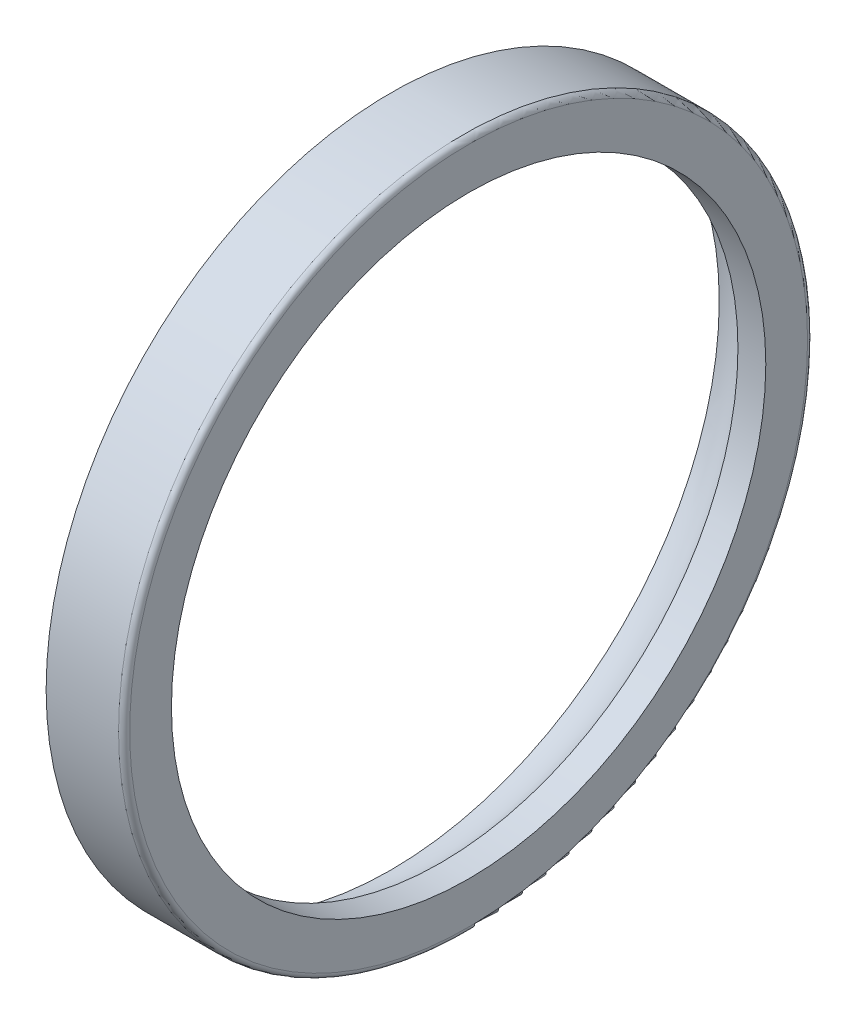
ISO-10303-21;
HEADER;
FILE_DESCRIPTION(('STEP AP214'),'2;1');
FILE_NAME('part.step','',(''),(''),'','','');
FILE_SCHEMA(('AUTOMOTIVE_DESIGN { 1 0 10303 214 1 1 1 1 }'));
ENDSEC;
DATA;
#1=APPLICATION_CONTEXT('core data for automotive mechanical design processes');
#2=APPLICATION_PROTOCOL_DEFINITION('international standard','automotive_design',2000,#1);
#3=PRODUCT_CONTEXT('',#1,'mechanical');
#4=PRODUCT('Part','Part','',(#3));
#5=PRODUCT_RELATED_PRODUCT_CATEGORY('part','',(#4));
#6=PRODUCT_DEFINITION_FORMATION('','',#4);
#7=PRODUCT_DEFINITION_CONTEXT('part definition',#1,'design');
#8=PRODUCT_DEFINITION('design','',#6,#7);
#9=PRODUCT_DEFINITION_SHAPE('','',#8);
#10=(LENGTH_UNIT() NAMED_UNIT(*) SI_UNIT(.MILLI.,.METRE.));
#11=(NAMED_UNIT(*) PLANE_ANGLE_UNIT() SI_UNIT($,.RADIAN.));
#12=(NAMED_UNIT(*) SI_UNIT($,.STERADIAN.) SOLID_ANGLE_UNIT());
#13=UNCERTAINTY_MEASURE_WITH_UNIT(LENGTH_MEASURE(1.E-05),#10,'distance_accuracy_value','');
#14=(GEOMETRIC_REPRESENTATION_CONTEXT(3) GLOBAL_UNCERTAINTY_ASSIGNED_CONTEXT((#13)) GLOBAL_UNIT_ASSIGNED_CONTEXT((#10,
#11,#12)) REPRESENTATION_CONTEXT('',''));
#15=CARTESIAN_POINT('',(0.,0.,0.));
#16=DIRECTION('',(0.,0.,1.));
#17=DIRECTION('',(1.,0.,0.));
#18=AXIS2_PLACEMENT_3D('',#15,#16,#17);
#19=CARTESIAN_POINT('',(11.7916312811596,30.9291947862988,0.));
#20=DIRECTION('',(-1.,0.,0.));
#21=DIRECTION('',(0.,0.,1.));
#22=AXIS2_PLACEMENT_3D('',#19,#20,#21);
#23=PLANE('',#22);
#24=CARTESIAN_POINT('',(11.7916312811596,0.,0.));
#25=DIRECTION('',(1.,0.,0.));
#26=DIRECTION('',(0.,0.,-1.));
#27=AXIS2_PLACEMENT_3D('',#24,#25,#26);
#28=CIRCLE('',#27,29.5);
#29=CARTESIAN_POINT('',(11.7916312811596,0.,-29.5));
#30=VERTEX_POINT('',#29);
#31=EDGE_CURVE('E10',#30,#30,#28,.T.);
#32=ORIENTED_EDGE('',*,*,#31,.T.);
#33=EDGE_LOOP('',(#32));
#34=FACE_BOUND('',#33,.T.);
#35=CARTESIAN_POINT('',(11.7916312811596,0.,0.));
#36=DIRECTION('',(1.,0.,0.));
#37=DIRECTION('',(0.,0.,-1.));
#38=AXIS2_PLACEMENT_3D('',#35,#36,#37);
#39=CIRCLE('',#38,30.9291947862988);
#40=CARTESIAN_POINT('',(11.7916312811596,0.,-30.9291947862988));
#41=VERTEX_POINT('',#40);
#42=EDGE_CURVE('E53',#41,#41,#39,.T.);
#43=ORIENTED_EDGE('',*,*,#42,.F.);
#44=EDGE_LOOP('',(#43));
#45=FACE_BOUND('',#44,.T.);
#46=ADVANCED_FACE('F31',(#34,#45),#23,.T.);
#47=CARTESIAN_POINT('',(11.7916312811596,0.,0.));
#48=DIRECTION('',(1.,0.,0.));
#49=DIRECTION('',(0.,0.,-1.));
#50=AXIS2_PLACEMENT_3D('',#47,#48,#49);
#51=TOROIDAL_SURFACE('',#50,24.5,5.);
#52=CARTESIAN_POINT('',(16.2917546220657,0.,0.));
#53=DIRECTION('',(1.,0.,0.));
#54=DIRECTION('',(0.,0.,-1.));
#55=AXIS2_PLACEMENT_3D('',#52,#53,#54);
#56=CIRCLE('',#55,26.6791947862988);
#57=CARTESIAN_POINT('',(16.2917546220657,0.,-26.6791947862988));
#58=VERTEX_POINT('',#57);
#59=EDGE_CURVE('E37',#58,#58,#56,.T.);
#60=ORIENTED_EDGE('',*,*,#59,.T.);
#61=EDGE_LOOP('',(#60));
#62=FACE_BOUND('',#61,.T.);
#63=ORIENTED_EDGE('',*,*,#31,.F.);
#64=EDGE_LOOP('',(#63));
#65=FACE_BOUND('',#64,.T.);
#66=ADVANCED_FACE('F61',(#62,#65),#51,.F.);
#67=CARTESIAN_POINT('',(21.3392308005234,0.,0.));
#68=DIRECTION('',(1.,0.,0.));
#69=DIRECTION('',(0.,0.,-1.));
#70=AXIS2_PLACEMENT_3D('',#67,#68,#69);
#71=CYLINDRICAL_SURFACE('',#70,26.6791947862988);
#72=CARTESIAN_POINT('',(18.7916312811596,0.,0.));
#73=DIRECTION('',(1.,0.,0.));
#74=DIRECTION('',(0.,0.,-1.));
#75=AXIS2_PLACEMENT_3D('',#72,#73,#74);
#76=CIRCLE('',#75,26.6791947862988);
#77=CARTESIAN_POINT('',(18.7916312811596,0.,-26.6791947862988));
#78=VERTEX_POINT('',#77);
#79=EDGE_CURVE('E41',#78,#78,#76,.T.);
#80=ORIENTED_EDGE('',*,*,#79,.T.);
#81=EDGE_LOOP('',(#80));
#82=FACE_BOUND('',#81,.T.);
#83=ORIENTED_EDGE('',*,*,#59,.F.);
#84=EDGE_LOOP('',(#83));
#85=FACE_BOUND('',#84,.T.);
#86=ADVANCED_FACE('F65',(#82,#85),#71,.F.);
#87=CARTESIAN_POINT('',(18.7916312811596,30.4291947862988,0.));
#88=DIRECTION('',(1.,0.,0.));
#89=DIRECTION('',(0.,0.,-1.));
#90=AXIS2_PLACEMENT_3D('',#87,#88,#89);
#91=PLANE('',#90);
#92=CARTESIAN_POINT('',(18.7916312811596,0.,0.));
#93=DIRECTION('',(1.,0.,0.));
#94=DIRECTION('',(0.,0.,-1.));
#95=AXIS2_PLACEMENT_3D('',#92,#93,#94);
#96=CIRCLE('',#95,30.4291947862988);
#97=CARTESIAN_POINT('',(18.7916312811596,0.,-30.4291947862988));
#98=VERTEX_POINT('',#97);
#99=EDGE_CURVE('E45',#98,#98,#96,.T.);
#100=ORIENTED_EDGE('',*,*,#99,.T.);
#101=EDGE_LOOP('',(#100));
#102=FACE_BOUND('',#101,.T.);
#103=ORIENTED_EDGE('',*,*,#79,.F.);
#104=EDGE_LOOP('',(#103));
#105=FACE_BOUND('',#104,.T.);
#106=ADVANCED_FACE('F69',(#102,#105),#91,.T.);
#107=CARTESIAN_POINT('',(18.2916312811596,0.,0.));
#108=DIRECTION('',(1.,0.,0.));
#109=DIRECTION('',(0.,0.,-1.));
#110=AXIS2_PLACEMENT_3D('',#107,#108,#109);
#111=TOROIDAL_SURFACE('',#110,30.4291947862988,0.5);
#112=CARTESIAN_POINT('',(18.2916312811596,0.,0.));
#113=DIRECTION('',(1.,0.,0.));
#114=DIRECTION('',(0.,0.,-1.));
#115=AXIS2_PLACEMENT_3D('',#112,#113,#114);
#116=CIRCLE('',#115,30.9291947862988);
#117=CARTESIAN_POINT('',(18.2916312811596,0.,-30.9291947862988));
#118=VERTEX_POINT('',#117);
#119=EDGE_CURVE('E50',#118,#118,#116,.T.);
#120=ORIENTED_EDGE('',*,*,#119,.T.);
#121=EDGE_LOOP('',(#120));
#122=FACE_BOUND('',#121,.T.);
#123=ORIENTED_EDGE('',*,*,#99,.F.);
#124=EDGE_LOOP('',(#123));
#125=FACE_BOUND('',#124,.T.);
#126=ADVANCED_FACE('F76',(#122,#125),#111,.T.);
#127=CARTESIAN_POINT('',(21.3392308005234,0.,0.));
#128=DIRECTION('',(1.,0.,0.));
#129=DIRECTION('',(0.,0.,-1.));
#130=AXIS2_PLACEMENT_3D('',#127,#128,#129);
#131=CYLINDRICAL_SURFACE('',#130,30.9291947862988);
#132=ORIENTED_EDGE('',*,*,#42,.T.);
#133=EDGE_LOOP('',(#132));
#134=FACE_BOUND('',#133,.T.);
#135=ORIENTED_EDGE('',*,*,#119,.F.);
#136=EDGE_LOOP('',(#135));
#137=FACE_BOUND('',#136,.T.);
#138=ADVANCED_FACE('F57',(#134,#137),#131,.T.);
#139=CLOSED_SHELL('',(#46,#66,#86,#106,#126,#138));
#140=MANIFOLD_SOLID_BREP('B2',#139);
#141=ADVANCED_BREP_SHAPE_REPRESENTATION('',(#18,#140),#14);
#142=SHAPE_DEFINITION_REPRESENTATION(#9,#141);
ENDSEC;
END-ISO-10303-21;
